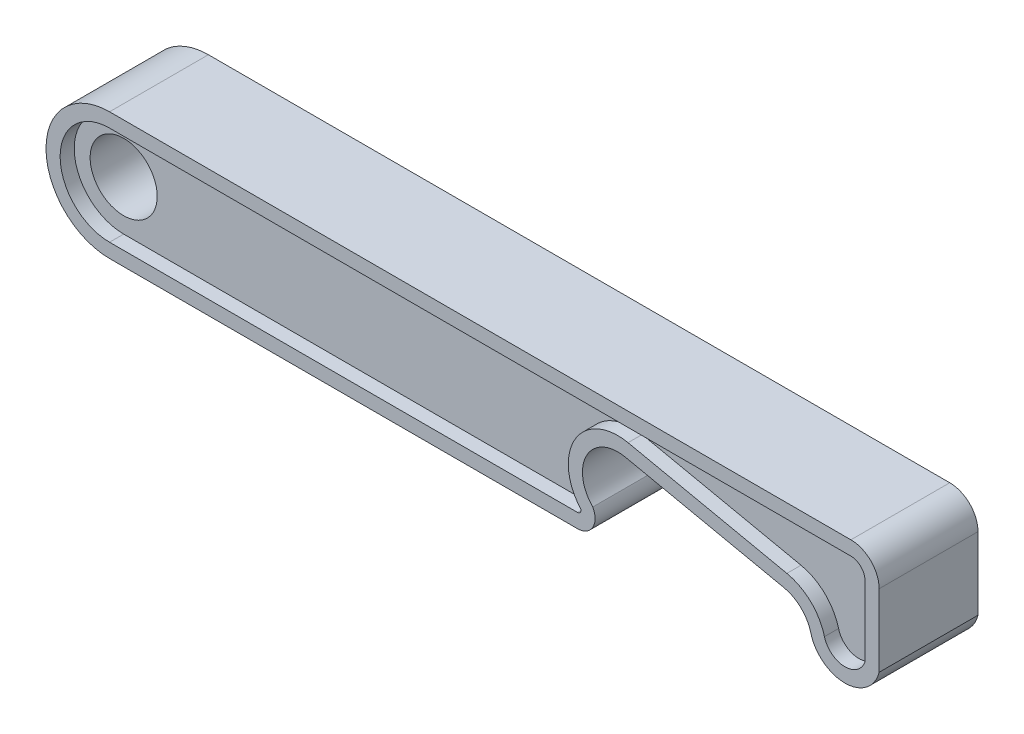
ISO-10303-21;
HEADER;
FILE_DESCRIPTION(('STEP AP214'),'2;1');
FILE_NAME('part.step','',(''),(''),'','','');
FILE_SCHEMA(('AUTOMOTIVE_DESIGN { 1 0 10303 214 1 1 1 1 }'));
ENDSEC;
DATA;
#1=APPLICATION_CONTEXT('core data for automotive mechanical design processes');
#2=APPLICATION_PROTOCOL_DEFINITION('international standard','automotive_design',2000,#1);
#3=PRODUCT_CONTEXT('',#1,'mechanical');
#4=PRODUCT('Part','Part','',(#3));
#5=PRODUCT_RELATED_PRODUCT_CATEGORY('part','',(#4));
#6=PRODUCT_DEFINITION_FORMATION('','',#4);
#7=PRODUCT_DEFINITION_CONTEXT('part definition',#1,'design');
#8=PRODUCT_DEFINITION('design','',#6,#7);
#9=PRODUCT_DEFINITION_SHAPE('','',#8);
#10=(LENGTH_UNIT() NAMED_UNIT(*) SI_UNIT(.MILLI.,.METRE.));
#11=(NAMED_UNIT(*) PLANE_ANGLE_UNIT() SI_UNIT($,.RADIAN.));
#12=(NAMED_UNIT(*) SI_UNIT($,.STERADIAN.) SOLID_ANGLE_UNIT());
#13=UNCERTAINTY_MEASURE_WITH_UNIT(LENGTH_MEASURE(1.E-05),#10,'distance_accuracy_value','');
#14=(GEOMETRIC_REPRESENTATION_CONTEXT(3) GLOBAL_UNCERTAINTY_ASSIGNED_CONTEXT((#13)) GLOBAL_UNIT_ASSIGNED_CONTEXT((#10,
#11,#12)) REPRESENTATION_CONTEXT('',''));
#15=CARTESIAN_POINT('',(0.,0.,0.));
#16=DIRECTION('',(0.,0.,1.));
#17=DIRECTION('',(1.,0.,0.));
#18=AXIS2_PLACEMENT_3D('',#15,#16,#17);
#19=CARTESIAN_POINT('',(0.,0.,5.));
#20=DIRECTION('',(0.,0.,1.));
#21=DIRECTION('',(1.,0.,0.));
#22=AXIS2_PLACEMENT_3D('',#19,#20,#21);
#23=PLANE('',#22);
#24=CARTESIAN_POINT('',(0.,0.,5.));
#25=DIRECTION('',(0.,0.,1.));
#26=DIRECTION('',(1.,0.,0.));
#27=AXIS2_PLACEMENT_3D('',#24,#25,#26);
#28=CIRCLE('',#27,4.75);
#29=CARTESIAN_POINT('',(4.75,0.,5.));
#30=VERTEX_POINT('',#29);
#31=EDGE_CURVE('E432',#30,#30,#28,.T.);
#32=ORIENTED_EDGE('',*,*,#31,.F.);
#33=EDGE_LOOP('',(#32));
#34=FACE_BOUND('',#33,.T.);
#35=CARTESIAN_POINT('',(105.,5.,5.));
#36=DIRECTION('',(0.,0.,1.));
#37=DIRECTION('',(1.,0.,0.));
#38=AXIS2_PLACEMENT_3D('',#35,#36,#37);
#39=CIRCLE('',#38,2.);
#40=CARTESIAN_POINT('',(107.,5.,5.));
#41=VERTEX_POINT('',#40);
#42=CARTESIAN_POINT('',(105.,7.,5.));
#43=VERTEX_POINT('',#42);
#44=EDGE_CURVE('E393',#41,#43,#39,.T.);
#45=ORIENTED_EDGE('',*,*,#44,.T.);
#46=DIRECTION('',(-1.,0.,0.));
#47=VECTOR('',#46,1.);
#48=CARTESIAN_POINT('',(0.,7.,5.));
#49=LINE('',#48,#47);
#50=CARTESIAN_POINT('',(0.,7.,5.));
#51=VERTEX_POINT('',#50);
#52=EDGE_CURVE('E428',#43,#51,#49,.T.);
#53=ORIENTED_EDGE('',*,*,#52,.T.);
#54=CARTESIAN_POINT('',(0.,0.,5.));
#55=DIRECTION('',(0.,0.,1.));
#56=DIRECTION('',(1.,0.,0.));
#57=AXIS2_PLACEMENT_3D('',#54,#55,#56);
#58=CIRCLE('',#57,7.);
#59=CARTESIAN_POINT('',(0.,-7.,5.));
#60=VERTEX_POINT('',#59);
#61=EDGE_CURVE('E253',#51,#60,#58,.T.);
#62=ORIENTED_EDGE('',*,*,#61,.T.);
#63=DIRECTION('',(1.,0.,0.));
#64=VECTOR('',#63,1.);
#65=CARTESIAN_POINT('',(0.,-7.,5.));
#66=LINE('',#65,#64);
#67=CARTESIAN_POINT('',(66.2727063305328,-7.00000000000004,5.));
#68=VERTEX_POINT('',#67);
#69=EDGE_CURVE('E422',#60,#68,#66,.T.);
#70=ORIENTED_EDGE('',*,*,#69,.T.);
#71=CARTESIAN_POINT('',(66.2727063305328,-6.5,5.));
#72=DIRECTION('',(0.,0.,1.));
#73=DIRECTION('',(1.,0.,0.));
#74=AXIS2_PLACEMENT_3D('',#71,#72,#73);
#75=CIRCLE('',#74,0.500000000000041);
#76=CARTESIAN_POINT('',(66.7591992004732,-6.38456738980158,5.));
#77=VERTEX_POINT('',#76);
#78=EDGE_CURVE('E418',#68,#77,#75,.T.);
#79=ORIENTED_EDGE('',*,*,#78,.T.);
#80=CARTESIAN_POINT('',(71.9763124517222,-1.71747736242449,5.));
#81=DIRECTION('',(0.,0.,1.));
#82=DIRECTION('',(1.,0.,0.));
#83=AXIS2_PLACEMENT_3D('',#80,#81,#82);
#84=CIRCLE('',#83,7.00000000000001);
#85=CARTESIAN_POINT('',(73.4316942874465,5.12955584271215,5.));
#86=VERTEX_POINT('',#85);
#87=EDGE_CURVE('E414',#77,#86,#84,.F.);
#88=ORIENTED_EDGE('',*,*,#87,.T.);
#89=DIRECTION('',(0.978147600733806,-0.20791169081776,0.));
#90=VECTOR('',#89,1.);
#91=CARTESIAN_POINT('',(4.21744092404212,19.8414995561952,5.));
#92=LINE('',#91,#90);
#93=CARTESIAN_POINT('',(95.9316942874465,0.347033205136645,5.));
#94=VERTEX_POINT('',#93);
#95=EDGE_CURVE('E410',#86,#94,#92,.T.);
#96=ORIENTED_EDGE('',*,*,#95,.T.);
#97=CARTESIAN_POINT('',(94.4763124517222,-6.5,5.));
#98=DIRECTION('',(0.,0.,1.));
#99=DIRECTION('',(1.,0.,0.));
#100=AXIS2_PLACEMENT_3D('',#97,#98,#99);
#101=CIRCLE('',#100,7.);
#102=CARTESIAN_POINT('',(101.254033307585,-4.74999999999999,5.));
#103=VERTEX_POINT('',#102);
#104=EDGE_CURVE('E406',#94,#103,#101,.F.);
#105=ORIENTED_EDGE('',*,*,#104,.T.);
#106=CARTESIAN_POINT('',(104.158770817241,-4.,5.));
#107=DIRECTION('',(0.,0.,1.));
#108=DIRECTION('',(1.,0.,0.));
#109=AXIS2_PLACEMENT_3D('',#106,#107,#108);
#110=CIRCLE('',#109,3.);
#111=CARTESIAN_POINT('',(107.,-4.96302478215106,5.));
#112=VERTEX_POINT('',#111);
#113=EDGE_CURVE('E402',#103,#112,#110,.T.);
#114=ORIENTED_EDGE('',*,*,#113,.T.);
#115=DIRECTION('',(0.,1.,0.));
#116=VECTOR('',#115,1.);
#117=CARTESIAN_POINT('',(107.,0.,5.));
#118=LINE('',#117,#116);
#119=EDGE_CURVE('E397',#112,#41,#118,.T.);
#120=ORIENTED_EDGE('',*,*,#119,.T.);
#121=EDGE_LOOP('',(#45,#53,#62,#70,#79,#88,#96,#105,#114,#120));
#122=FACE_BOUND('',#121,.T.);
#123=ADVANCED_FACE('F49',(#34,#122),#23,.T.);
#124=CARTESIAN_POINT('',(0.,0.,-5.));
#125=DIRECTION('',(0.,0.,1.));
#126=DIRECTION('',(1.,0.,0.));
#127=AXIS2_PLACEMENT_3D('',#124,#125,#126);
#128=PLANE('',#127);
#129=CARTESIAN_POINT('',(0.,0.,-5.));
#130=DIRECTION('',(0.,0.,1.));
#131=DIRECTION('',(1.,0.,0.));
#132=AXIS2_PLACEMENT_3D('',#129,#130,#131);
#133=CIRCLE('',#132,4.75);
#134=CARTESIAN_POINT('',(4.75,0.,-5.));
#135=VERTEX_POINT('',#134);
#136=EDGE_CURVE('E431',#135,#135,#133,.T.);
#137=ORIENTED_EDGE('',*,*,#136,.T.);
#138=EDGE_LOOP('',(#137));
#139=FACE_BOUND('',#138,.T.);
#140=DIRECTION('',(-1.,0.,0.));
#141=VECTOR('',#140,1.);
#142=CARTESIAN_POINT('',(0.,7.,-5.));
#143=LINE('',#142,#141);
#144=CARTESIAN_POINT('',(105.,7.,-5.));
#145=VERTEX_POINT('',#144);
#146=CARTESIAN_POINT('',(0.,7.,-5.));
#147=VERTEX_POINT('',#146);
#148=EDGE_CURVE('E12',#145,#147,#143,.T.);
#149=ORIENTED_EDGE('',*,*,#148,.F.);
#150=CARTESIAN_POINT('',(105.,5.,-5.));
#151=DIRECTION('',(0.,0.,1.));
#152=DIRECTION('',(1.,0.,0.));
#153=AXIS2_PLACEMENT_3D('',#150,#151,#152);
#154=CIRCLE('',#153,2.);
#155=CARTESIAN_POINT('',(107.,5.,-5.));
#156=VERTEX_POINT('',#155);
#157=EDGE_CURVE('E469',#156,#145,#154,.T.);
#158=ORIENTED_EDGE('',*,*,#157,.F.);
#159=DIRECTION('',(0.,1.,0.));
#160=VECTOR('',#159,1.);
#161=CARTESIAN_POINT('',(107.,0.,-5.));
#162=LINE('',#161,#160);
#163=CARTESIAN_POINT('',(107.,-4.96302478215106,-5.));
#164=VERTEX_POINT('',#163);
#165=EDGE_CURVE('E473',#164,#156,#162,.T.);
#166=ORIENTED_EDGE('',*,*,#165,.F.);
#167=CARTESIAN_POINT('',(104.158770817241,-4.,-5.));
#168=DIRECTION('',(0.,0.,1.));
#169=DIRECTION('',(1.,0.,0.));
#170=AXIS2_PLACEMENT_3D('',#167,#168,#169);
#171=CIRCLE('',#170,3.);
#172=CARTESIAN_POINT('',(101.254033307585,-4.74999999999999,-5.));
#173=VERTEX_POINT('',#172);
#174=EDGE_CURVE('E477',#173,#164,#171,.T.);
#175=ORIENTED_EDGE('',*,*,#174,.F.);
#176=CARTESIAN_POINT('',(94.4763124517222,-6.5,-5.));
#177=DIRECTION('',(0.,0.,1.));
#178=DIRECTION('',(1.,0.,0.));
#179=AXIS2_PLACEMENT_3D('',#176,#177,#178);
#180=CIRCLE('',#179,7.);
#181=CARTESIAN_POINT('',(95.9316942874465,0.347033205136645,-5.));
#182=VERTEX_POINT('',#181);
#183=EDGE_CURVE('E481',#182,#173,#180,.F.);
#184=ORIENTED_EDGE('',*,*,#183,.F.);
#185=DIRECTION('',(0.978147600733806,-0.20791169081776,0.));
#186=VECTOR('',#185,1.);
#187=CARTESIAN_POINT('',(4.21744092404212,19.8414995561952,-5.));
#188=LINE('',#187,#186);
#189=CARTESIAN_POINT('',(73.4316942874465,5.12955584271215,-5.));
#190=VERTEX_POINT('',#189);
#191=EDGE_CURVE('E485',#190,#182,#188,.T.);
#192=ORIENTED_EDGE('',*,*,#191,.F.);
#193=CARTESIAN_POINT('',(71.9763124517222,-1.71747736242449,-5.));
#194=DIRECTION('',(0.,0.,1.));
#195=DIRECTION('',(1.,0.,0.));
#196=AXIS2_PLACEMENT_3D('',#193,#194,#195);
#197=CIRCLE('',#196,7.00000000000001);
#198=CARTESIAN_POINT('',(66.7591992004732,-6.38456738980158,-5.));
#199=VERTEX_POINT('',#198);
#200=EDGE_CURVE('E489',#199,#190,#197,.F.);
#201=ORIENTED_EDGE('',*,*,#200,.F.);
#202=CARTESIAN_POINT('',(66.2727063305328,-6.5,-5.));
#203=DIRECTION('',(0.,0.,1.));
#204=DIRECTION('',(1.,0.,0.));
#205=AXIS2_PLACEMENT_3D('',#202,#203,#204);
#206=CIRCLE('',#205,0.500000000000041);
#207=CARTESIAN_POINT('',(66.2727063305328,-7.00000000000004,-5.));
#208=VERTEX_POINT('',#207);
#209=EDGE_CURVE('E493',#208,#199,#206,.T.);
#210=ORIENTED_EDGE('',*,*,#209,.F.);
#211=DIRECTION('',(1.,0.,0.));
#212=VECTOR('',#211,1.);
#213=CARTESIAN_POINT('',(0.,-7.,-5.));
#214=LINE('',#213,#212);
#215=CARTESIAN_POINT('',(0.,-7.,-5.));
#216=VERTEX_POINT('',#215);
#217=EDGE_CURVE('E497',#216,#208,#214,.T.);
#218=ORIENTED_EDGE('',*,*,#217,.F.);
#219=CARTESIAN_POINT('',(0.,0.,-5.));
#220=DIRECTION('',(0.,0.,1.));
#221=DIRECTION('',(1.,0.,0.));
#222=AXIS2_PLACEMENT_3D('',#219,#220,#221);
#223=CIRCLE('',#222,7.);
#224=EDGE_CURVE('E58',#147,#216,#223,.T.);
#225=ORIENTED_EDGE('',*,*,#224,.F.);
#226=EDGE_LOOP('',(#149,#158,#166,#175,#184,#192,#201,#210,#218,#225));
#227=FACE_BOUND('',#226,.T.);
#228=ADVANCED_FACE('F622',(#139,#227),#128,.F.);
#229=CARTESIAN_POINT('',(0.,0.,5.));
#230=DIRECTION('',(0.,0.,-1.));
#231=DIRECTION('',(-1.,0.,0.));
#232=AXIS2_PLACEMENT_3D('',#229,#230,#231);
#233=CYLINDRICAL_SURFACE('',#232,4.75);
#234=ORIENTED_EDGE('',*,*,#31,.T.);
#235=EDGE_LOOP('',(#234));
#236=FACE_BOUND('',#235,.T.);
#237=ORIENTED_EDGE('',*,*,#136,.F.);
#238=EDGE_LOOP('',(#237));
#239=FACE_BOUND('',#238,.T.);
#240=ADVANCED_FACE('F51',(#236,#239),#233,.F.);
#241=CARTESIAN_POINT('',(0.,0.,-7.));
#242=DIRECTION('',(0.,0.,1.));
#243=DIRECTION('',(1.,0.,0.));
#244=AXIS2_PLACEMENT_3D('',#241,#242,#243);
#245=PLANE('',#244);
#246=CARTESIAN_POINT('',(105.,5.,-7.00000000000001));
#247=DIRECTION('',(0.,0.,1.));
#248=DIRECTION('',(1.,0.,0.));
#249=AXIS2_PLACEMENT_3D('',#246,#247,#248);
#250=CIRCLE('',#249,4.);
#251=CARTESIAN_POINT('',(105.,9.,-7.00000000000001));
#252=VERTEX_POINT('',#251);
#253=CARTESIAN_POINT('',(109.,5.,-7.00000000000001));
#254=VERTEX_POINT('',#253);
#255=EDGE_CURVE('E546',#252,#254,#250,.F.);
#256=ORIENTED_EDGE('',*,*,#255,.T.);
#257=DIRECTION('',(0.,-1.,0.));
#258=VECTOR('',#257,1.);
#259=CARTESIAN_POINT('',(109.,-5.25,-7.00000000000001));
#260=LINE('',#259,#258);
#261=CARTESIAN_POINT('',(109.,-5.25,-7.00000000000001));
#262=VERTEX_POINT('',#261);
#263=EDGE_CURVE('E577',#254,#262,#260,.T.);
#264=ORIENTED_EDGE('',*,*,#263,.T.);
#265=CARTESIAN_POINT('',(104.158770817241,-4.,-7.00000000000001));
#266=DIRECTION('',(0.,0.,1.));
#267=DIRECTION('',(1.,0.,0.));
#268=AXIS2_PLACEMENT_3D('',#265,#266,#267);
#269=CIRCLE('',#268,5.);
#270=CARTESIAN_POINT('',(99.3175416344815,-5.24999999999999,-7.00000000000001));
#271=VERTEX_POINT('',#270);
#272=EDGE_CURVE('E573',#262,#271,#269,.F.);
#273=ORIENTED_EDGE('',*,*,#272,.T.);
#274=CARTESIAN_POINT('',(94.4763124517222,-6.5,-7.00000000000001));
#275=DIRECTION('',(0.,0.,1.));
#276=DIRECTION('',(1.,0.,0.));
#277=AXIS2_PLACEMENT_3D('',#274,#275,#276);
#278=CIRCLE('',#277,5.);
#279=CARTESIAN_POINT('',(95.515870905811,-1.60926199633096,-7.00000000000001));
#280=VERTEX_POINT('',#279);
#281=EDGE_CURVE('E569',#271,#280,#278,.T.);
#282=ORIENTED_EDGE('',*,*,#281,.T.);
#283=DIRECTION('',(-0.978147600733806,0.20791169081776,0.));
#284=VECTOR('',#283,1.);
#285=CARTESIAN_POINT('',(73.015870905811,3.17326064124454,-7.00000000000001));
#286=LINE('',#285,#284);
#287=CARTESIAN_POINT('',(73.015870905811,3.17326064124454,-7.00000000000001));
#288=VERTEX_POINT('',#287);
#289=EDGE_CURVE('E565',#280,#288,#286,.T.);
#290=ORIENTED_EDGE('',*,*,#289,.T.);
#291=CARTESIAN_POINT('',(71.9763124517222,-1.71747736242449,-7.00000000000001));
#292=DIRECTION('',(0.,0.,1.));
#293=DIRECTION('',(1.,0.,0.));
#294=AXIS2_PLACEMENT_3D('',#291,#292,#293);
#295=CIRCLE('',#294,5.);
#296=CARTESIAN_POINT('',(68.4377698399939,-5.25,-7.00000000000001));
#297=VERTEX_POINT('',#296);
#298=EDGE_CURVE('E561',#288,#297,#295,.T.);
#299=ORIENTED_EDGE('',*,*,#298,.T.);
#300=CARTESIAN_POINT('',(66.2727063305328,-6.5,-7.00000000000001));
#301=DIRECTION('',(0.,0.,1.));
#302=DIRECTION('',(1.,0.,0.));
#303=AXIS2_PLACEMENT_3D('',#300,#301,#302);
#304=CIRCLE('',#303,2.5);
#305=CARTESIAN_POINT('',(66.2727063305328,-9.,-7.00000000000001));
#306=VERTEX_POINT('',#305);
#307=EDGE_CURVE('E557',#297,#306,#304,.F.);
#308=ORIENTED_EDGE('',*,*,#307,.T.);
#309=DIRECTION('',(-1.,0.,0.));
#310=VECTOR('',#309,1.);
#311=CARTESIAN_POINT('',(0.,-9.,-7.00000000000001));
#312=LINE('',#311,#310);
#313=CARTESIAN_POINT('',(0.,-9.,-7.00000000000001));
#314=VERTEX_POINT('',#313);
#315=EDGE_CURVE('E553',#306,#314,#312,.T.);
#316=ORIENTED_EDGE('',*,*,#315,.T.);
#317=CARTESIAN_POINT('',(0.,0.,-7.00000000000001));
#318=DIRECTION('',(0.,0.,1.));
#319=DIRECTION('',(1.,0.,0.));
#320=AXIS2_PLACEMENT_3D('',#317,#318,#319);
#321=CIRCLE('',#320,9.);
#322=CARTESIAN_POINT('',(0.,9.,-7.00000000000001));
#323=VERTEX_POINT('',#322);
#324=EDGE_CURVE('E392',#314,#323,#321,.F.);
#325=ORIENTED_EDGE('',*,*,#324,.T.);
#326=DIRECTION('',(1.,0.,0.));
#327=VECTOR('',#326,1.);
#328=CARTESIAN_POINT('',(105.,9.,-7.00000000000001));
#329=LINE('',#328,#327);
#330=EDGE_CURVE('E398',#323,#252,#329,.T.);
#331=ORIENTED_EDGE('',*,*,#330,.T.);
#332=EDGE_LOOP('',(#256,#264,#273,#282,#290,#299,#308,#316,#325,#331));
#333=FACE_BOUND('',#332,.T.);
#334=DIRECTION('',(1.,0.,0.));
#335=VECTOR('',#334,1.);
#336=CARTESIAN_POINT('',(105.,7.,-7.00000000000001));
#337=LINE('',#336,#335);
#338=CARTESIAN_POINT('',(0.,7.,-7.00000000000001));
#339=VERTEX_POINT('',#338);
#340=CARTESIAN_POINT('',(105.,7.,-7.00000000000001));
#341=VERTEX_POINT('',#340);
#342=EDGE_CURVE('E388',#339,#341,#337,.T.);
#343=ORIENTED_EDGE('',*,*,#342,.F.);
#344=CARTESIAN_POINT('',(0.,0.,-7.00000000000001));
#345=DIRECTION('',(0.,0.,1.));
#346=DIRECTION('',(1.,0.,0.));
#347=AXIS2_PLACEMENT_3D('',#344,#345,#346);
#348=CIRCLE('',#347,7.);
#349=CARTESIAN_POINT('',(0.,-7.,-7.00000000000001));
#350=VERTEX_POINT('',#349);
#351=EDGE_CURVE('E514',#350,#339,#348,.F.);
#352=ORIENTED_EDGE('',*,*,#351,.F.);
#353=DIRECTION('',(-1.,0.,0.));
#354=VECTOR('',#353,1.);
#355=CARTESIAN_POINT('',(0.,-7.,-7.00000000000001));
#356=LINE('',#355,#354);
#357=CARTESIAN_POINT('',(66.2727063305328,-7.,-7.00000000000001));
#358=VERTEX_POINT('',#357);
#359=EDGE_CURVE('E510',#358,#350,#356,.T.);
#360=ORIENTED_EDGE('',*,*,#359,.F.);
#361=CARTESIAN_POINT('',(66.2727063305328,-6.5,-7.00000000000001));
#362=DIRECTION('',(0.,0.,1.));
#363=DIRECTION('',(1.,0.,0.));
#364=AXIS2_PLACEMENT_3D('',#361,#362,#363);
#365=CIRCLE('',#364,0.500000000000041);
#366=CARTESIAN_POINT('',(66.7591992004732,-6.38456738980159,-7.00000000000001));
#367=VERTEX_POINT('',#366);
#368=EDGE_CURVE('E515',#367,#358,#365,.F.);
#369=ORIENTED_EDGE('',*,*,#368,.F.);
#370=CARTESIAN_POINT('',(71.9763124517222,-1.71747736242449,-7.00000000000001));
#371=DIRECTION('',(0.,0.,1.));
#372=DIRECTION('',(1.,0.,0.));
#373=AXIS2_PLACEMENT_3D('',#370,#371,#372);
#374=CIRCLE('',#373,7.00000000000001);
#375=CARTESIAN_POINT('',(73.4316942874465,5.12955584271215,-7.00000000000001));
#376=VERTEX_POINT('',#375);
#377=EDGE_CURVE('E520',#376,#367,#374,.T.);
#378=ORIENTED_EDGE('',*,*,#377,.F.);
#379=DIRECTION('',(-0.978147600733806,0.20791169081776,0.));
#380=VECTOR('',#379,1.);
#381=CARTESIAN_POINT('',(73.4316942874465,5.12955584271215,-7.00000000000001));
#382=LINE('',#381,#380);
#383=CARTESIAN_POINT('',(95.9316942874465,0.347033205136648,-7.00000000000001));
#384=VERTEX_POINT('',#383);
#385=EDGE_CURVE('E526',#384,#376,#382,.T.);
#386=ORIENTED_EDGE('',*,*,#385,.F.);
#387=CARTESIAN_POINT('',(94.4763124517222,-6.5,-7.00000000000001));
#388=DIRECTION('',(0.,0.,1.));
#389=DIRECTION('',(1.,0.,0.));
#390=AXIS2_PLACEMENT_3D('',#387,#388,#389);
#391=CIRCLE('',#390,7.);
#392=CARTESIAN_POINT('',(101.254033307585,-4.74999999999999,-7.00000000000001));
#393=VERTEX_POINT('',#392);
#394=EDGE_CURVE('E530',#393,#384,#391,.T.);
#395=ORIENTED_EDGE('',*,*,#394,.F.);
#396=CARTESIAN_POINT('',(104.158770817241,-4.,-7.00000000000001));
#397=DIRECTION('',(0.,0.,1.));
#398=DIRECTION('',(1.,0.,0.));
#399=AXIS2_PLACEMENT_3D('',#396,#397,#398);
#400=CIRCLE('',#399,3.);
#401=CARTESIAN_POINT('',(107.,-4.96302478215106,-7.00000000000001));
#402=VERTEX_POINT('',#401);
#403=EDGE_CURVE('E534',#402,#393,#400,.F.);
#404=ORIENTED_EDGE('',*,*,#403,.F.);
#405=DIRECTION('',(0.,-1.,0.));
#406=VECTOR('',#405,1.);
#407=CARTESIAN_POINT('',(107.,-4.96302478215106,-7.00000000000001));
#408=LINE('',#407,#406);
#409=CARTESIAN_POINT('',(107.,5.,-7.00000000000001));
#410=VERTEX_POINT('',#409);
#411=EDGE_CURVE('E538',#410,#402,#408,.T.);
#412=ORIENTED_EDGE('',*,*,#411,.F.);
#413=CARTESIAN_POINT('',(105.,5.,-7.00000000000001));
#414=DIRECTION('',(0.,0.,1.));
#415=DIRECTION('',(1.,0.,0.));
#416=AXIS2_PLACEMENT_3D('',#413,#414,#415);
#417=CIRCLE('',#416,2.);
#418=EDGE_CURVE('E542',#341,#410,#417,.F.);
#419=ORIENTED_EDGE('',*,*,#418,.F.);
#420=EDGE_LOOP('',(#343,#352,#360,#369,#378,#386,#395,#404,#412,#419));
#421=FACE_BOUND('',#420,.T.);
#422=ADVANCED_FACE('F684',(#333,#421),#245,.F.);
#423=CARTESIAN_POINT('',(105.,5.,-128.364986491014));
#424=DIRECTION('',(0.,0.,1.));
#425=DIRECTION('',(1.,0.,0.));
#426=AXIS2_PLACEMENT_3D('',#423,#424,#425);
#427=CYLINDRICAL_SURFACE('',#426,2.);
#428=DIRECTION('',(0.,0.,1.));
#429=VECTOR('',#428,1.);
#430=CARTESIAN_POINT('',(107.,5.,-128.364986491014));
#431=LINE('',#430,#429);
#432=EDGE_CURVE('E303',#410,#156,#431,.T.);
#433=ORIENTED_EDGE('',*,*,#432,.T.);
#434=ORIENTED_EDGE('',*,*,#157,.T.);
#435=DIRECTION('',(0.,0.,1.));
#436=VECTOR('',#435,1.);
#437=CARTESIAN_POINT('',(105.,7.,-128.364986491014));
#438=LINE('',#437,#436);
#439=EDGE_CURVE('E258',#341,#145,#438,.T.);
#440=ORIENTED_EDGE('',*,*,#439,.F.);
#441=ORIENTED_EDGE('',*,*,#418,.T.);
#442=EDGE_LOOP('',(#433,#434,#440,#441));
#443=FACE_BOUND('',#442,.T.);
#444=ADVANCED_FACE('F711',(#443),#427,.F.);
#445=CARTESIAN_POINT('',(107.,-4.96302478215106,-128.364986491014));
#446=DIRECTION('',(1.,0.,0.));
#447=DIRECTION('',(0.,0.,-1.));
#448=AXIS2_PLACEMENT_3D('',#445,#446,#447);
#449=PLANE('',#448);
#450=DIRECTION('',(0.,0.,1.));
#451=VECTOR('',#450,1.);
#452=CARTESIAN_POINT('',(107.,-4.96302478215106,-128.364986491014));
#453=LINE('',#452,#451);
#454=EDGE_CURVE('E309',#402,#164,#453,.T.);
#455=ORIENTED_EDGE('',*,*,#454,.T.);
#456=ORIENTED_EDGE('',*,*,#165,.T.);
#457=ORIENTED_EDGE('',*,*,#432,.F.);
#458=ORIENTED_EDGE('',*,*,#411,.T.);
#459=EDGE_LOOP('',(#455,#456,#457,#458));
#460=FACE_BOUND('',#459,.T.);
#461=ADVANCED_FACE('F716',(#460),#449,.F.);
#462=CARTESIAN_POINT('',(104.158770817241,-4.,-128.364986491014));
#463=DIRECTION('',(0.,0.,1.));
#464=DIRECTION('',(1.,0.,0.));
#465=AXIS2_PLACEMENT_3D('',#462,#463,#464);
#466=CYLINDRICAL_SURFACE('',#465,3.);
#467=DIRECTION('',(0.,0.,1.));
#468=VECTOR('',#467,1.);
#469=CARTESIAN_POINT('',(101.254033307585,-4.74999999999999,-128.364986491014));
#470=LINE('',#469,#468);
#471=EDGE_CURVE('E314',#393,#173,#470,.T.);
#472=ORIENTED_EDGE('',*,*,#471,.T.);
#473=ORIENTED_EDGE('',*,*,#174,.T.);
#474=ORIENTED_EDGE('',*,*,#454,.F.);
#475=ORIENTED_EDGE('',*,*,#403,.T.);
#476=EDGE_LOOP('',(#472,#473,#474,#475));
#477=FACE_BOUND('',#476,.T.);
#478=ADVANCED_FACE('F723',(#477),#466,.F.);
#479=CARTESIAN_POINT('',(94.4763124517222,-6.5,-128.364986491014));
#480=DIRECTION('',(0.,0.,1.));
#481=DIRECTION('',(1.,0.,0.));
#482=AXIS2_PLACEMENT_3D('',#479,#480,#481);
#483=CYLINDRICAL_SURFACE('',#482,7.);
#484=DIRECTION('',(0.,0.,1.));
#485=VECTOR('',#484,1.);
#486=CARTESIAN_POINT('',(95.9316942874465,0.347033205136645,-128.364986491014));
#487=LINE('',#486,#485);
#488=EDGE_CURVE('E319',#384,#182,#487,.T.);
#489=ORIENTED_EDGE('',*,*,#488,.T.);
#490=ORIENTED_EDGE('',*,*,#183,.T.);
#491=ORIENTED_EDGE('',*,*,#471,.F.);
#492=ORIENTED_EDGE('',*,*,#394,.T.);
#493=EDGE_LOOP('',(#489,#490,#491,#492));
#494=FACE_BOUND('',#493,.T.);
#495=ADVANCED_FACE('F732',(#494),#483,.T.);
#496=CARTESIAN_POINT('',(73.4316942874465,5.12955584271215,-128.364986491014));
#497=DIRECTION('',(-0.20791169081776,-0.978147600733806,0.));
#498=DIRECTION('',(0.978147600733806,-0.20791169081776,0.));
#499=AXIS2_PLACEMENT_3D('',#496,#497,#498);
#500=PLANE('',#499);
#501=DIRECTION('',(0.,0.,1.));
#502=VECTOR('',#501,1.);
#503=CARTESIAN_POINT('',(73.4316942874465,5.12955584271215,-128.364986491014));
#504=LINE('',#503,#502);
#505=EDGE_CURVE('E324',#376,#190,#504,.T.);
#506=ORIENTED_EDGE('',*,*,#505,.T.);
#507=ORIENTED_EDGE('',*,*,#191,.T.);
#508=ORIENTED_EDGE('',*,*,#488,.F.);
#509=ORIENTED_EDGE('',*,*,#385,.T.);
#510=EDGE_LOOP('',(#506,#507,#508,#509));
#511=FACE_BOUND('',#510,.T.);
#512=ADVANCED_FACE('F735',(#511),#500,.F.);
#513=CARTESIAN_POINT('',(71.9763124517222,-1.71747736242449,-128.364986491014));
#514=DIRECTION('',(0.,0.,1.));
#515=DIRECTION('',(1.,0.,0.));
#516=AXIS2_PLACEMENT_3D('',#513,#514,#515);
#517=CYLINDRICAL_SURFACE('',#516,7.00000000000001);
#518=DIRECTION('',(0.,0.,1.));
#519=VECTOR('',#518,1.);
#520=CARTESIAN_POINT('',(66.7591992004732,-6.38456738980158,-128.364986491014));
#521=LINE('',#520,#519);
#522=EDGE_CURVE('E329',#367,#199,#521,.T.);
#523=ORIENTED_EDGE('',*,*,#522,.T.);
#524=ORIENTED_EDGE('',*,*,#200,.T.);
#525=ORIENTED_EDGE('',*,*,#505,.F.);
#526=ORIENTED_EDGE('',*,*,#377,.T.);
#527=EDGE_LOOP('',(#523,#524,#525,#526));
#528=FACE_BOUND('',#527,.T.);
#529=ADVANCED_FACE('F738',(#528),#517,.T.);
#530=CARTESIAN_POINT('',(66.2727063305328,-6.5,-128.364986491014));
#531=DIRECTION('',(0.,0.,1.));
#532=DIRECTION('',(1.,0.,0.));
#533=AXIS2_PLACEMENT_3D('',#530,#531,#532);
#534=CYLINDRICAL_SURFACE('',#533,0.500000000000041);
#535=DIRECTION('',(0.,0.,1.));
#536=VECTOR('',#535,1.);
#537=CARTESIAN_POINT('',(66.2727063305328,-7.00000000000004,-128.364986491014));
#538=LINE('',#537,#536);
#539=EDGE_CURVE('E334',#358,#208,#538,.T.);
#540=ORIENTED_EDGE('',*,*,#539,.T.);
#541=ORIENTED_EDGE('',*,*,#209,.T.);
#542=ORIENTED_EDGE('',*,*,#522,.F.);
#543=ORIENTED_EDGE('',*,*,#368,.T.);
#544=EDGE_LOOP('',(#540,#541,#542,#543));
#545=FACE_BOUND('',#544,.T.);
#546=ADVANCED_FACE('F741',(#545),#534,.F.);
#547=CARTESIAN_POINT('',(0.,-7.,-128.364986491014));
#548=DIRECTION('',(0.,-1.,0.));
#549=DIRECTION('',(1.,0.,0.));
#550=AXIS2_PLACEMENT_3D('',#547,#548,#549);
#551=PLANE('',#550);
#552=DIRECTION('',(0.,0.,1.));
#553=VECTOR('',#552,1.);
#554=CARTESIAN_POINT('',(0.,-7.,-128.364986491014));
#555=LINE('',#554,#553);
#556=EDGE_CURVE('E339',#350,#216,#555,.T.);
#557=ORIENTED_EDGE('',*,*,#556,.T.);
#558=ORIENTED_EDGE('',*,*,#217,.T.);
#559=ORIENTED_EDGE('',*,*,#539,.F.);
#560=ORIENTED_EDGE('',*,*,#359,.T.);
#561=EDGE_LOOP('',(#557,#558,#559,#560));
#562=FACE_BOUND('',#561,.T.);
#563=ADVANCED_FACE('F508',(#562),#551,.F.);
#564=CARTESIAN_POINT('',(0.,0.,-128.364986491014));
#565=DIRECTION('',(0.,0.,1.));
#566=DIRECTION('',(1.,0.,0.));
#567=AXIS2_PLACEMENT_3D('',#564,#565,#566);
#568=CYLINDRICAL_SURFACE('',#567,7.);
#569=DIRECTION('',(0.,0.,1.));
#570=VECTOR('',#569,1.);
#571=CARTESIAN_POINT('',(0.,7.,-128.364986491014));
#572=LINE('',#571,#570);
#573=EDGE_CURVE('E257',#339,#147,#572,.T.);
#574=ORIENTED_EDGE('',*,*,#573,.T.);
#575=ORIENTED_EDGE('',*,*,#224,.T.);
#576=ORIENTED_EDGE('',*,*,#556,.F.);
#577=ORIENTED_EDGE('',*,*,#351,.T.);
#578=EDGE_LOOP('',(#574,#575,#576,#577));
#579=FACE_BOUND('',#578,.T.);
#580=ADVANCED_FACE('F503',(#579),#568,.F.);
#581=CARTESIAN_POINT('',(105.,7.,-128.364986491014));
#582=DIRECTION('',(0.,1.,0.));
#583=DIRECTION('',(-1.,0.,0.));
#584=AXIS2_PLACEMENT_3D('',#581,#582,#583);
#585=PLANE('',#584);
#586=ORIENTED_EDGE('',*,*,#439,.T.);
#587=ORIENTED_EDGE('',*,*,#148,.T.);
#588=ORIENTED_EDGE('',*,*,#573,.F.);
#589=ORIENTED_EDGE('',*,*,#342,.T.);
#590=EDGE_LOOP('',(#586,#587,#588,#589));
#591=FACE_BOUND('',#590,.T.);
#592=ADVANCED_FACE('F672',(#591),#585,.F.);
#593=CARTESIAN_POINT('',(105.,5.,5.));
#594=DIRECTION('',(0.,0.,-1.));
#595=DIRECTION('',(-1.,0.,0.));
#596=AXIS2_PLACEMENT_3D('',#593,#594,#595);
#597=CYLINDRICAL_SURFACE('',#596,4.);
#598=DIRECTION('',(0.,0.,-1.));
#599=VECTOR('',#598,1.);
#600=CARTESIAN_POINT('',(109.,5.,5.));
#601=LINE('',#600,#599);
#602=CARTESIAN_POINT('',(109.,5.,7.));
#603=VERTEX_POINT('',#602);
#604=EDGE_CURVE('E436',#603,#254,#601,.T.);
#605=ORIENTED_EDGE('',*,*,#604,.T.);
#606=ORIENTED_EDGE('',*,*,#255,.F.);
#607=DIRECTION('',(0.,0.,-1.));
#608=VECTOR('',#607,1.);
#609=CARTESIAN_POINT('',(105.,9.,5.));
#610=LINE('',#609,#608);
#611=CARTESIAN_POINT('',(105.,9.,7.));
#612=VERTEX_POINT('',#611);
#613=EDGE_CURVE('E466',#612,#252,#610,.T.);
#614=ORIENTED_EDGE('',*,*,#613,.F.);
#615=CARTESIAN_POINT('',(105.,5.,7.));
#616=DIRECTION('',(0.,0.,1.));
#617=DIRECTION('',(1.,0.,0.));
#618=AXIS2_PLACEMENT_3D('',#615,#616,#617);
#619=CIRCLE('',#618,4.);
#620=EDGE_CURVE('E307',#603,#612,#619,.T.);
#621=ORIENTED_EDGE('',*,*,#620,.F.);
#622=EDGE_LOOP('',(#605,#606,#614,#621));
#623=FACE_BOUND('',#622,.T.);
#624=ADVANCED_FACE('F639',(#623),#597,.T.);
#625=CARTESIAN_POINT('',(109.,0.,5.));
#626=DIRECTION('',(-1.,0.,0.));
#627=DIRECTION('',(0.,0.,1.));
#628=AXIS2_PLACEMENT_3D('',#625,#626,#627);
#629=PLANE('',#628);
#630=DIRECTION('',(0.,0.,-1.));
#631=VECTOR('',#630,1.);
#632=CARTESIAN_POINT('',(109.,-5.25,5.));
#633=LINE('',#632,#631);
#634=CARTESIAN_POINT('',(109.,-5.25,7.));
#635=VERTEX_POINT('',#634);
#636=EDGE_CURVE('E442',#635,#262,#633,.T.);
#637=ORIENTED_EDGE('',*,*,#636,.T.);
#638=ORIENTED_EDGE('',*,*,#263,.F.);
#639=ORIENTED_EDGE('',*,*,#604,.F.);
#640=DIRECTION('',(0.,1.,0.));
#641=VECTOR('',#640,1.);
#642=CARTESIAN_POINT('',(109.,-5.25,7.));
#643=LINE('',#642,#641);
#644=EDGE_CURVE('E384',#635,#603,#643,.T.);
#645=ORIENTED_EDGE('',*,*,#644,.F.);
#646=EDGE_LOOP('',(#637,#638,#639,#645));
#647=FACE_BOUND('',#646,.T.);
#648=ADVANCED_FACE('F635',(#647),#629,.F.);
#649=CARTESIAN_POINT('',(104.158770817241,-4.,5.));
#650=DIRECTION('',(0.,0.,-1.));
#651=DIRECTION('',(-1.,0.,0.));
#652=AXIS2_PLACEMENT_3D('',#649,#650,#651);
#653=CYLINDRICAL_SURFACE('',#652,5.);
#654=DIRECTION('',(0.,0.,-1.));
#655=VECTOR('',#654,1.);
#656=CARTESIAN_POINT('',(99.3175416344815,-5.25,5.));
#657=LINE('',#656,#655);
#658=CARTESIAN_POINT('',(99.3175416344815,-5.24999999999999,7.));
#659=VERTEX_POINT('',#658);
#660=EDGE_CURVE('E445',#659,#271,#657,.T.);
#661=ORIENTED_EDGE('',*,*,#660,.T.);
#662=ORIENTED_EDGE('',*,*,#272,.F.);
#663=ORIENTED_EDGE('',*,*,#636,.F.);
#664=CARTESIAN_POINT('',(104.158770817241,-4.,7.));
#665=DIRECTION('',(0.,0.,1.));
#666=DIRECTION('',(1.,0.,0.));
#667=AXIS2_PLACEMENT_3D('',#664,#665,#666);
#668=CIRCLE('',#667,5.);
#669=EDGE_CURVE('E380',#659,#635,#668,.T.);
#670=ORIENTED_EDGE('',*,*,#669,.F.);
#671=EDGE_LOOP('',(#661,#662,#663,#670));
#672=FACE_BOUND('',#671,.T.);
#673=ADVANCED_FACE('F638',(#672),#653,.T.);
#674=CARTESIAN_POINT('',(94.4763124517222,-6.5,5.));
#675=DIRECTION('',(0.,0.,-1.));
#676=DIRECTION('',(-1.,0.,0.));
#677=AXIS2_PLACEMENT_3D('',#674,#675,#676);
#678=CYLINDRICAL_SURFACE('',#677,5.);
#679=DIRECTION('',(0.,0.,-1.));
#680=VECTOR('',#679,1.);
#681=CARTESIAN_POINT('',(95.515870905811,-1.60926199633096,5.));
#682=LINE('',#681,#680);
#683=CARTESIAN_POINT('',(95.515870905811,-1.60926199633097,7.));
#684=VERTEX_POINT('',#683);
#685=EDGE_CURVE('E448',#684,#280,#682,.T.);
#686=ORIENTED_EDGE('',*,*,#685,.T.);
#687=ORIENTED_EDGE('',*,*,#281,.F.);
#688=ORIENTED_EDGE('',*,*,#660,.F.);
#689=CARTESIAN_POINT('',(94.4763124517222,-6.5,7.));
#690=DIRECTION('',(0.,0.,-1.));
#691=DIRECTION('',(1.,0.,0.));
#692=AXIS2_PLACEMENT_3D('',#689,#690,#691);
#693=CIRCLE('',#692,5.);
#694=EDGE_CURVE('E376',#684,#659,#693,.T.);
#695=ORIENTED_EDGE('',*,*,#694,.F.);
#696=EDGE_LOOP('',(#686,#687,#688,#695));
#697=FACE_BOUND('',#696,.T.);
#698=ADVANCED_FACE('F643',(#697),#678,.F.);
#699=CARTESIAN_POINT('',(3.80161754240661,17.8852043547276,5.));
#700=DIRECTION('',(0.20791169081776,0.978147600733806,0.));
#701=DIRECTION('',(-0.978147600733806,0.20791169081776,0.));
#702=AXIS2_PLACEMENT_3D('',#699,#700,#701);
#703=PLANE('',#702);
#704=DIRECTION('',(0.,0.,-1.));
#705=VECTOR('',#704,1.);
#706=CARTESIAN_POINT('',(73.015870905811,3.17326064124454,5.));
#707=LINE('',#706,#705);
#708=CARTESIAN_POINT('',(73.015870905811,3.17326064124454,7.));
#709=VERTEX_POINT('',#708);
#710=EDGE_CURVE('E451',#709,#288,#707,.T.);
#711=ORIENTED_EDGE('',*,*,#710,.T.);
#712=ORIENTED_EDGE('',*,*,#289,.F.);
#713=ORIENTED_EDGE('',*,*,#685,.F.);
#714=DIRECTION('',(0.978147600733806,-0.20791169081776,0.));
#715=VECTOR('',#714,1.);
#716=CARTESIAN_POINT('',(73.015870905811,3.17326064124454,7.));
#717=LINE('',#716,#715);
#718=EDGE_CURVE('E372',#709,#684,#717,.T.);
#719=ORIENTED_EDGE('',*,*,#718,.F.);
#720=EDGE_LOOP('',(#711,#712,#713,#719));
#721=FACE_BOUND('',#720,.T.);
#722=ADVANCED_FACE('F647',(#721),#703,.F.);
#723=CARTESIAN_POINT('',(71.9763124517222,-1.71747736242449,5.));
#724=DIRECTION('',(0.,0.,-1.));
#725=DIRECTION('',(-1.,0.,0.));
#726=AXIS2_PLACEMENT_3D('',#723,#724,#725);
#727=CYLINDRICAL_SURFACE('',#726,5.);
#728=DIRECTION('',(0.,0.,-1.));
#729=VECTOR('',#728,1.);
#730=CARTESIAN_POINT('',(68.4377698399939,-5.25,5.));
#731=LINE('',#730,#729);
#732=CARTESIAN_POINT('',(68.4377698399939,-5.25,7.));
#733=VERTEX_POINT('',#732);
#734=EDGE_CURVE('E454',#733,#297,#731,.T.);
#735=ORIENTED_EDGE('',*,*,#734,.T.);
#736=ORIENTED_EDGE('',*,*,#298,.F.);
#737=ORIENTED_EDGE('',*,*,#710,.F.);
#738=CARTESIAN_POINT('',(71.9763124517222,-1.71747736242449,7.));
#739=DIRECTION('',(0.,0.,-1.));
#740=DIRECTION('',(1.,0.,0.));
#741=AXIS2_PLACEMENT_3D('',#738,#739,#740);
#742=CIRCLE('',#741,5.);
#743=EDGE_CURVE('E368',#733,#709,#742,.T.);
#744=ORIENTED_EDGE('',*,*,#743,.F.);
#745=EDGE_LOOP('',(#735,#736,#737,#744));
#746=FACE_BOUND('',#745,.T.);
#747=ADVANCED_FACE('F651',(#746),#727,.F.);
#748=CARTESIAN_POINT('',(66.2727063305328,-6.5,5.));
#749=DIRECTION('',(0.,0.,-1.));
#750=DIRECTION('',(-1.,0.,0.));
#751=AXIS2_PLACEMENT_3D('',#748,#749,#750);
#752=CYLINDRICAL_SURFACE('',#751,2.5);
#753=DIRECTION('',(0.,0.,-1.));
#754=VECTOR('',#753,1.);
#755=CARTESIAN_POINT('',(66.2727063305328,-9.,5.));
#756=LINE('',#755,#754);
#757=CARTESIAN_POINT('',(66.2727063305328,-9.00000000000001,7.));
#758=VERTEX_POINT('',#757);
#759=EDGE_CURVE('E457',#758,#306,#756,.T.);
#760=ORIENTED_EDGE('',*,*,#759,.T.);
#761=ORIENTED_EDGE('',*,*,#307,.F.);
#762=ORIENTED_EDGE('',*,*,#734,.F.);
#763=CARTESIAN_POINT('',(66.2727063305328,-6.5,7.));
#764=DIRECTION('',(0.,0.,1.));
#765=DIRECTION('',(1.,0.,0.));
#766=AXIS2_PLACEMENT_3D('',#763,#764,#765);
#767=CIRCLE('',#766,2.5);
#768=EDGE_CURVE('E364',#758,#733,#767,.T.);
#769=ORIENTED_EDGE('',*,*,#768,.F.);
#770=EDGE_LOOP('',(#760,#761,#762,#769));
#771=FACE_BOUND('',#770,.T.);
#772=ADVANCED_FACE('F655',(#771),#752,.T.);
#773=CARTESIAN_POINT('',(0.,-9.,5.));
#774=DIRECTION('',(0.,1.,0.));
#775=DIRECTION('',(0.,0.,1.));
#776=AXIS2_PLACEMENT_3D('',#773,#774,#775);
#777=PLANE('',#776);
#778=DIRECTION('',(0.,0.,-1.));
#779=VECTOR('',#778,1.);
#780=CARTESIAN_POINT('',(0.,-9.,5.));
#781=LINE('',#780,#779);
#782=CARTESIAN_POINT('',(0.,-9.,7.));
#783=VERTEX_POINT('',#782);
#784=EDGE_CURVE('E460',#783,#314,#781,.T.);
#785=ORIENTED_EDGE('',*,*,#784,.T.);
#786=ORIENTED_EDGE('',*,*,#315,.F.);
#787=ORIENTED_EDGE('',*,*,#759,.F.);
#788=DIRECTION('',(1.,0.,0.));
#789=VECTOR('',#788,1.);
#790=CARTESIAN_POINT('',(0.,-9.,7.));
#791=LINE('',#790,#789);
#792=EDGE_CURVE('E360',#783,#758,#791,.T.);
#793=ORIENTED_EDGE('',*,*,#792,.F.);
#794=EDGE_LOOP('',(#785,#786,#787,#793));
#795=FACE_BOUND('',#794,.T.);
#796=ADVANCED_FACE('F659',(#795),#777,.F.);
#797=CARTESIAN_POINT('',(0.,0.,5.));
#798=DIRECTION('',(0.,0.,-1.));
#799=DIRECTION('',(-1.,0.,0.));
#800=AXIS2_PLACEMENT_3D('',#797,#798,#799);
#801=CYLINDRICAL_SURFACE('',#800,9.);
#802=DIRECTION('',(0.,0.,-1.));
#803=VECTOR('',#802,1.);
#804=CARTESIAN_POINT('',(0.,9.,5.));
#805=LINE('',#804,#803);
#806=CARTESIAN_POINT('',(0.,9.,7.));
#807=VERTEX_POINT('',#806);
#808=EDGE_CURVE('E463',#807,#323,#805,.T.);
#809=ORIENTED_EDGE('',*,*,#808,.T.);
#810=ORIENTED_EDGE('',*,*,#324,.F.);
#811=ORIENTED_EDGE('',*,*,#784,.F.);
#812=CARTESIAN_POINT('',(0.,0.,7.));
#813=DIRECTION('',(0.,0.,1.));
#814=DIRECTION('',(1.,0.,0.));
#815=AXIS2_PLACEMENT_3D('',#812,#813,#814);
#816=CIRCLE('',#815,9.);
#817=EDGE_CURVE('E356',#807,#783,#816,.T.);
#818=ORIENTED_EDGE('',*,*,#817,.F.);
#819=EDGE_LOOP('',(#809,#810,#811,#818));
#820=FACE_BOUND('',#819,.T.);
#821=ADVANCED_FACE('F663',(#820),#801,.T.);
#822=CARTESIAN_POINT('',(0.,9.,5.));
#823=DIRECTION('',(0.,1.,0.));
#824=DIRECTION('',(-1.,0.,0.));
#825=AXIS2_PLACEMENT_3D('',#822,#823,#824);
#826=PLANE('',#825);
#827=ORIENTED_EDGE('',*,*,#613,.T.);
#828=ORIENTED_EDGE('',*,*,#330,.F.);
#829=ORIENTED_EDGE('',*,*,#808,.F.);
#830=DIRECTION('',(-1.,0.,0.));
#831=VECTOR('',#830,1.);
#832=CARTESIAN_POINT('',(105.,9.,7.));
#833=LINE('',#832,#831);
#834=EDGE_CURVE('E352',#612,#807,#833,.T.);
#835=ORIENTED_EDGE('',*,*,#834,.F.);
#836=EDGE_LOOP('',(#827,#828,#829,#835));
#837=FACE_BOUND('',#836,.T.);
#838=ADVANCED_FACE('F667',(#837),#826,.T.);
#839=CARTESIAN_POINT('',(105.,5.,7.));
#840=DIRECTION('',(0.,0.,1.));
#841=DIRECTION('',(1.,0.,0.));
#842=AXIS2_PLACEMENT_3D('',#839,#840,#841);
#843=PLANE('',#842);
#844=CARTESIAN_POINT('',(105.,5.,7.));
#845=DIRECTION('',(0.,0.,1.));
#846=DIRECTION('',(1.,0.,0.));
#847=AXIS2_PLACEMENT_3D('',#844,#845,#846);
#848=CIRCLE('',#847,2.);
#849=CARTESIAN_POINT('',(107.,5.,7.));
#850=VERTEX_POINT('',#849);
#851=CARTESIAN_POINT('',(105.,7.,7.));
#852=VERTEX_POINT('',#851);
#853=EDGE_CURVE('E266',#850,#852,#848,.T.);
#854=ORIENTED_EDGE('',*,*,#853,.F.);
#855=DIRECTION('',(0.,1.,0.));
#856=VECTOR('',#855,1.);
#857=CARTESIAN_POINT('',(107.,-4.96302478215106,7.));
#858=LINE('',#857,#856);
#859=CARTESIAN_POINT('',(107.,-4.96302478215106,7.));
#860=VERTEX_POINT('',#859);
#861=EDGE_CURVE('E299',#860,#850,#858,.T.);
#862=ORIENTED_EDGE('',*,*,#861,.F.);
#863=CARTESIAN_POINT('',(104.158770817241,-4.,7.));
#864=DIRECTION('',(0.,0.,1.));
#865=DIRECTION('',(1.,0.,0.));
#866=AXIS2_PLACEMENT_3D('',#863,#864,#865);
#867=CIRCLE('',#866,3.);
#868=CARTESIAN_POINT('',(101.254033307585,-4.74999999999999,7.));
#869=VERTEX_POINT('',#868);
#870=EDGE_CURVE('E295',#869,#860,#867,.T.);
#871=ORIENTED_EDGE('',*,*,#870,.F.);
#872=CARTESIAN_POINT('',(94.4763124517222,-6.5,7.));
#873=DIRECTION('',(0.,0.,-1.));
#874=DIRECTION('',(1.,0.,0.));
#875=AXIS2_PLACEMENT_3D('',#872,#873,#874);
#876=CIRCLE('',#875,7.);
#877=CARTESIAN_POINT('',(95.9316942874465,0.347033205136645,7.));
#878=VERTEX_POINT('',#877);
#879=EDGE_CURVE('E291',#878,#869,#876,.T.);
#880=ORIENTED_EDGE('',*,*,#879,.F.);
#881=DIRECTION('',(0.978147600733806,-0.20791169081776,0.));
#882=VECTOR('',#881,1.);
#883=CARTESIAN_POINT('',(73.4316942874465,5.12955584271215,7.));
#884=LINE('',#883,#882);
#885=CARTESIAN_POINT('',(73.4316942874465,5.12955584271215,7.));
#886=VERTEX_POINT('',#885);
#887=EDGE_CURVE('E287',#886,#878,#884,.T.);
#888=ORIENTED_EDGE('',*,*,#887,.F.);
#889=CARTESIAN_POINT('',(71.9763124517222,-1.71747736242449,7.));
#890=DIRECTION('',(0.,0.,-1.));
#891=DIRECTION('',(1.,0.,0.));
#892=AXIS2_PLACEMENT_3D('',#889,#890,#891);
#893=CIRCLE('',#892,7.00000000000001);
#894=CARTESIAN_POINT('',(66.7591992004732,-6.38456738980158,7.));
#895=VERTEX_POINT('',#894);
#896=EDGE_CURVE('E283',#895,#886,#893,.T.);
#897=ORIENTED_EDGE('',*,*,#896,.F.);
#898=CARTESIAN_POINT('',(66.2727063305328,-6.5,7.));
#899=DIRECTION('',(0.,0.,1.));
#900=DIRECTION('',(1.,0.,0.));
#901=AXIS2_PLACEMENT_3D('',#898,#899,#900);
#902=CIRCLE('',#901,0.500000000000041);
#903=CARTESIAN_POINT('',(66.2727063305328,-7.00000000000004,7.));
#904=VERTEX_POINT('',#903);
#905=EDGE_CURVE('E276',#904,#895,#902,.T.);
#906=ORIENTED_EDGE('',*,*,#905,.F.);
#907=DIRECTION('',(1.,0.,0.));
#908=VECTOR('',#907,1.);
#909=CARTESIAN_POINT('',(0.,-7.,7.));
#910=LINE('',#909,#908);
#911=CARTESIAN_POINT('',(0.,-7.,7.));
#912=VERTEX_POINT('',#911);
#913=EDGE_CURVE('E272',#912,#904,#910,.T.);
#914=ORIENTED_EDGE('',*,*,#913,.F.);
#915=CARTESIAN_POINT('',(0.,0.,7.));
#916=DIRECTION('',(0.,0.,1.));
#917=DIRECTION('',(1.,0.,0.));
#918=AXIS2_PLACEMENT_3D('',#915,#916,#917);
#919=CIRCLE('',#918,7.);
#920=CARTESIAN_POINT('',(0.,7.,7.));
#921=VERTEX_POINT('',#920);
#922=EDGE_CURVE('E250',#921,#912,#919,.T.);
#923=ORIENTED_EDGE('',*,*,#922,.F.);
#924=DIRECTION('',(-1.,0.,0.));
#925=VECTOR('',#924,1.);
#926=CARTESIAN_POINT('',(105.,7.,7.));
#927=LINE('',#926,#925);
#928=EDGE_CURVE('E261',#852,#921,#927,.T.);
#929=ORIENTED_EDGE('',*,*,#928,.F.);
#930=EDGE_LOOP('',(#854,#862,#871,#880,#888,#897,#906,#914,#923,#929));
#931=FACE_BOUND('',#930,.T.);
#932=ORIENTED_EDGE('',*,*,#620,.T.);
#933=ORIENTED_EDGE('',*,*,#834,.T.);
#934=ORIENTED_EDGE('',*,*,#817,.T.);
#935=ORIENTED_EDGE('',*,*,#792,.T.);
#936=ORIENTED_EDGE('',*,*,#768,.T.);
#937=ORIENTED_EDGE('',*,*,#743,.T.);
#938=ORIENTED_EDGE('',*,*,#718,.T.);
#939=ORIENTED_EDGE('',*,*,#694,.T.);
#940=ORIENTED_EDGE('',*,*,#669,.T.);
#941=ORIENTED_EDGE('',*,*,#644,.T.);
#942=EDGE_LOOP('',(#932,#933,#934,#935,#936,#937,#938,#939,#940,#941));
#943=FACE_BOUND('',#942,.T.);
#944=ADVANCED_FACE('F268',(#931,#943),#843,.T.);
#945=ORIENTED_EDGE('',*,*,#52,.F.);
#946=EDGE_CURVE('E65',#43,#852,#438,.T.);
#947=ORIENTED_EDGE('',*,*,#946,.T.);
#948=ORIENTED_EDGE('',*,*,#928,.T.);
#949=EDGE_CURVE('E245',#51,#921,#572,.T.);
#950=ORIENTED_EDGE('',*,*,#949,.F.);
#951=EDGE_LOOP('',(#945,#947,#948,#950));
#952=FACE_BOUND('',#951,.T.);
#953=ADVANCED_FACE('F262',(#952),#585,.F.);
#954=ORIENTED_EDGE('',*,*,#61,.F.);
#955=ORIENTED_EDGE('',*,*,#949,.T.);
#956=ORIENTED_EDGE('',*,*,#922,.T.);
#957=EDGE_CURVE('E342',#60,#912,#555,.T.);
#958=ORIENTED_EDGE('',*,*,#957,.F.);
#959=EDGE_LOOP('',(#954,#955,#956,#958));
#960=FACE_BOUND('',#959,.T.);
#961=ADVANCED_FACE('F247',(#960),#568,.F.);
#962=ORIENTED_EDGE('',*,*,#69,.F.);
#963=ORIENTED_EDGE('',*,*,#957,.T.);
#964=ORIENTED_EDGE('',*,*,#913,.T.);
#965=EDGE_CURVE('E338',#68,#904,#538,.T.);
#966=ORIENTED_EDGE('',*,*,#965,.F.);
#967=EDGE_LOOP('',(#962,#963,#964,#966));
#968=FACE_BOUND('',#967,.T.);
#969=ADVANCED_FACE('F615',(#968),#551,.F.);
#970=ORIENTED_EDGE('',*,*,#78,.F.);
#971=ORIENTED_EDGE('',*,*,#965,.T.);
#972=ORIENTED_EDGE('',*,*,#905,.T.);
#973=EDGE_CURVE('E333',#77,#895,#521,.T.);
#974=ORIENTED_EDGE('',*,*,#973,.F.);
#975=EDGE_LOOP('',(#970,#971,#972,#974));
#976=FACE_BOUND('',#975,.T.);
#977=ADVANCED_FACE('F611',(#976),#534,.F.);
#978=ORIENTED_EDGE('',*,*,#87,.F.);
#979=ORIENTED_EDGE('',*,*,#973,.T.);
#980=ORIENTED_EDGE('',*,*,#896,.T.);
#981=EDGE_CURVE('E328',#86,#886,#504,.T.);
#982=ORIENTED_EDGE('',*,*,#981,.F.);
#983=EDGE_LOOP('',(#978,#979,#980,#982));
#984=FACE_BOUND('',#983,.T.);
#985=ADVANCED_FACE('F607',(#984),#517,.T.);
#986=ORIENTED_EDGE('',*,*,#95,.F.);
#987=ORIENTED_EDGE('',*,*,#981,.T.);
#988=ORIENTED_EDGE('',*,*,#887,.T.);
#989=EDGE_CURVE('E323',#94,#878,#487,.T.);
#990=ORIENTED_EDGE('',*,*,#989,.F.);
#991=EDGE_LOOP('',(#986,#987,#988,#990));
#992=FACE_BOUND('',#991,.T.);
#993=ADVANCED_FACE('F603',(#992),#500,.F.);
#994=ORIENTED_EDGE('',*,*,#104,.F.);
#995=ORIENTED_EDGE('',*,*,#989,.T.);
#996=ORIENTED_EDGE('',*,*,#879,.T.);
#997=EDGE_CURVE('E318',#103,#869,#470,.T.);
#998=ORIENTED_EDGE('',*,*,#997,.F.);
#999=EDGE_LOOP('',(#994,#995,#996,#998));
#1000=FACE_BOUND('',#999,.T.);
#1001=ADVANCED_FACE('F598',(#1000),#483,.T.);
#1002=ORIENTED_EDGE('',*,*,#113,.F.);
#1003=ORIENTED_EDGE('',*,*,#997,.T.);
#1004=ORIENTED_EDGE('',*,*,#870,.T.);
#1005=EDGE_CURVE('E313',#112,#860,#453,.T.);
#1006=ORIENTED_EDGE('',*,*,#1005,.F.);
#1007=EDGE_LOOP('',(#1002,#1003,#1004,#1006));
#1008=FACE_BOUND('',#1007,.T.);
#1009=ADVANCED_FACE('F594',(#1008),#466,.F.);
#1010=ORIENTED_EDGE('',*,*,#119,.F.);
#1011=ORIENTED_EDGE('',*,*,#1005,.T.);
#1012=ORIENTED_EDGE('',*,*,#861,.T.);
#1013=EDGE_CURVE('E308',#41,#850,#431,.T.);
#1014=ORIENTED_EDGE('',*,*,#1013,.F.);
#1015=EDGE_LOOP('',(#1010,#1011,#1012,#1014));
#1016=FACE_BOUND('',#1015,.T.);
#1017=ADVANCED_FACE('F590',(#1016),#449,.F.);
#1018=ORIENTED_EDGE('',*,*,#44,.F.);
#1019=ORIENTED_EDGE('',*,*,#1013,.T.);
#1020=ORIENTED_EDGE('',*,*,#853,.T.);
#1021=ORIENTED_EDGE('',*,*,#946,.F.);
#1022=EDGE_LOOP('',(#1018,#1019,#1020,#1021));
#1023=FACE_BOUND('',#1022,.T.);
#1024=ADVANCED_FACE('F584',(#1023),#427,.F.);
#1025=CLOSED_SHELL('',(#123,#228,#240,#422,#444,#461,#478,#495,#512,#529,#546,#563,#580,#592,
#624,#648,#673,#698,#722,#747,#772,#796,#821,#838,#944,#953,#961,#969,#977,#985,#993,#1001,
#1009,#1017,#1024));
#1026=MANIFOLD_SOLID_BREP('B2',#1025);
#1027=ADVANCED_BREP_SHAPE_REPRESENTATION('',(#18,#1026),#14);
#1028=SHAPE_DEFINITION_REPRESENTATION(#9,#1027);
ENDSEC;
END-ISO-10303-21;
